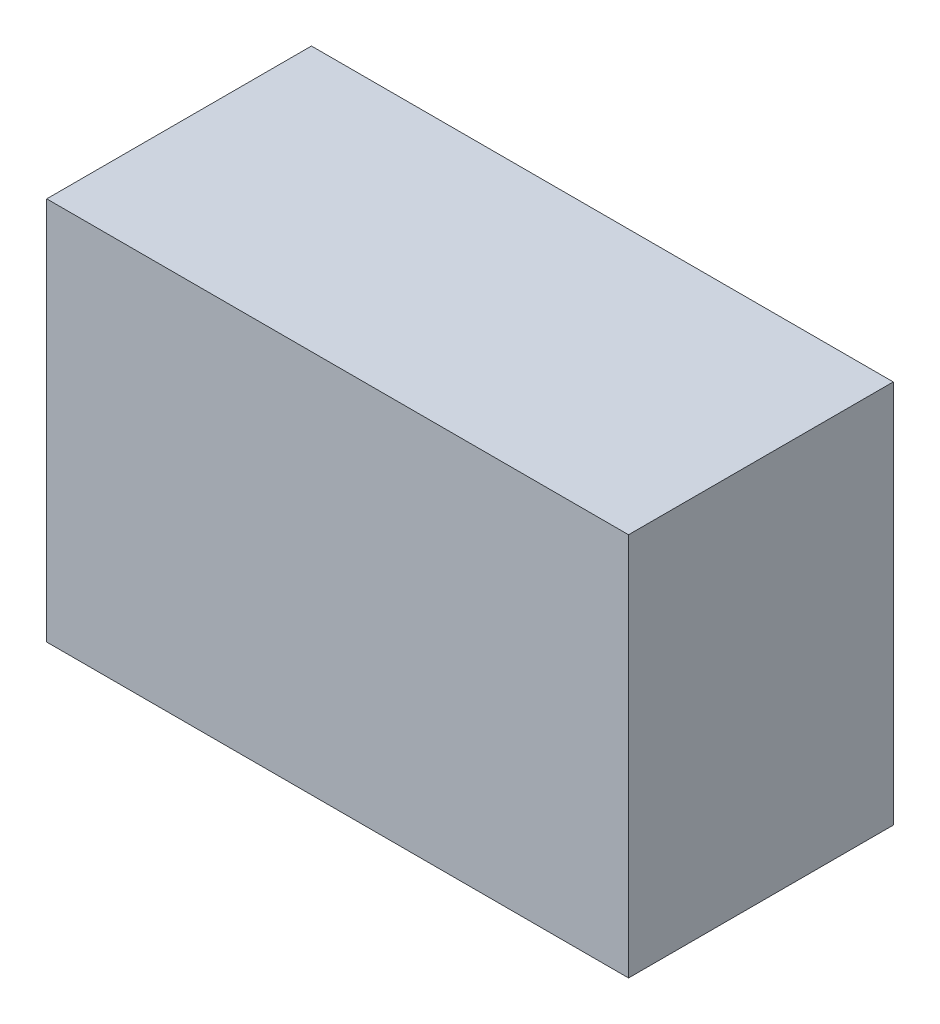
ISO-10303-21;
HEADER;
FILE_DESCRIPTION(('STEP AP214'),'2;1');
FILE_NAME('part.step','',(''),(''),'','','');
FILE_SCHEMA(('AUTOMOTIVE_DESIGN { 1 0 10303 214 1 1 1 1 }'));
ENDSEC;
DATA;
#1=APPLICATION_CONTEXT('core data for automotive mechanical design processes');
#2=APPLICATION_PROTOCOL_DEFINITION('international standard','automotive_design',2000,#1);
#3=PRODUCT_CONTEXT('',#1,'mechanical');
#4=PRODUCT('Part','Part','',(#3));
#5=PRODUCT_RELATED_PRODUCT_CATEGORY('part','',(#4));
#6=PRODUCT_DEFINITION_FORMATION('','',#4);
#7=PRODUCT_DEFINITION_CONTEXT('part definition',#1,'design');
#8=PRODUCT_DEFINITION('design','',#6,#7);
#9=PRODUCT_DEFINITION_SHAPE('','',#8);
#10=(LENGTH_UNIT() NAMED_UNIT(*) SI_UNIT(.MILLI.,.METRE.));
#11=(NAMED_UNIT(*) PLANE_ANGLE_UNIT() SI_UNIT($,.RADIAN.));
#12=(NAMED_UNIT(*) SI_UNIT($,.STERADIAN.) SOLID_ANGLE_UNIT());
#13=UNCERTAINTY_MEASURE_WITH_UNIT(LENGTH_MEASURE(1.E-05),#10,'distance_accuracy_value','');
#14=(GEOMETRIC_REPRESENTATION_CONTEXT(3) GLOBAL_UNCERTAINTY_ASSIGNED_CONTEXT((#13)) GLOBAL_UNIT_ASSIGNED_CONTEXT((#10,
#11,#12)) REPRESENTATION_CONTEXT('',''));
#15=CARTESIAN_POINT('',(0.,0.,0.));
#16=DIRECTION('',(0.,0.,1.));
#17=DIRECTION('',(1.,0.,0.));
#18=AXIS2_PLACEMENT_3D('',#15,#16,#17);
#19=CARTESIAN_POINT('',(0.,0.,1.));
#20=DIRECTION('',(0.,0.,1.));
#21=DIRECTION('',(1.,0.,0.));
#22=AXIS2_PLACEMENT_3D('',#19,#20,#21);
#23=PLANE('',#22);
#24=DIRECTION('',(1.,0.,0.));
#25=VECTOR('',#24,1.);
#26=CARTESIAN_POINT('',(1.1057,0.7262,1.));
#27=LINE('',#26,#25);
#28=CARTESIAN_POINT('',(-1.0922,0.7262,1.));
#29=VERTEX_POINT('',#28);
#30=CARTESIAN_POINT('',(1.1057,0.7262,1.));
#31=VERTEX_POINT('',#30);
#32=EDGE_CURVE('E68',#29,#31,#27,.T.);
#33=ORIENTED_EDGE('',*,*,#32,.F.);
#34=DIRECTION('',(0.,1.,0.));
#35=VECTOR('',#34,1.);
#36=CARTESIAN_POINT('',(-1.0922,0.7262,1.));
#37=LINE('',#36,#35);
#38=CARTESIAN_POINT('',(-1.0922,-0.7239,1.));
#39=VERTEX_POINT('',#38);
#40=EDGE_CURVE('E20',#39,#29,#37,.T.);
#41=ORIENTED_EDGE('',*,*,#40,.F.);
#42=DIRECTION('',(1.,0.,0.));
#43=VECTOR('',#42,1.);
#44=CARTESIAN_POINT('',(-1.0922,-0.7239,1.));
#45=LINE('',#44,#43);
#46=CARTESIAN_POINT('',(1.1057,-0.7239,1.));
#47=VERTEX_POINT('',#46);
#48=EDGE_CURVE('E58',#47,#39,#45,.F.);
#49=ORIENTED_EDGE('',*,*,#48,.F.);
#50=DIRECTION('',(0.,1.,0.));
#51=VECTOR('',#50,1.);
#52=CARTESIAN_POINT('',(1.1057,-0.7239,1.));
#53=LINE('',#52,#51);
#54=EDGE_CURVE('E53',#31,#47,#53,.F.);
#55=ORIENTED_EDGE('',*,*,#54,.F.);
#56=EDGE_LOOP('',(#33,#41,#49,#55));
#57=FACE_BOUND('',#56,.T.);
#58=ADVANCED_FACE('F17',(#57),#23,.T.);
#59=CARTESIAN_POINT('',(-1.0922,0.7262,0.));
#60=DIRECTION('',(-1.,0.,0.));
#61=DIRECTION('',(0.,0.,1.));
#62=AXIS2_PLACEMENT_3D('',#59,#60,#61);
#63=PLANE('',#62);
#64=DIRECTION('',(0.,0.,1.));
#65=VECTOR('',#64,1.);
#66=CARTESIAN_POINT('',(-1.0922,0.7262,0.));
#67=LINE('',#66,#65);
#68=CARTESIAN_POINT('',(-1.0922,0.7262,0.));
#69=VERTEX_POINT('',#68);
#70=EDGE_CURVE('E79',#69,#29,#67,.T.);
#71=ORIENTED_EDGE('',*,*,#70,.F.);
#72=DIRECTION('',(0.,1.,0.));
#73=VECTOR('',#72,1.);
#74=CARTESIAN_POINT('',(-1.0922,0.,0.));
#75=LINE('',#74,#73);
#76=CARTESIAN_POINT('',(-1.0922,-0.7239,0.));
#77=VERTEX_POINT('',#76);
#78=EDGE_CURVE('E74',#69,#77,#75,.F.);
#79=ORIENTED_EDGE('',*,*,#78,.T.);
#80=DIRECTION('',(0.,0.,-1.));
#81=VECTOR('',#80,1.);
#82=CARTESIAN_POINT('',(-1.0922,-0.7239,0.));
#83=LINE('',#82,#81);
#84=EDGE_CURVE('E63',#39,#77,#83,.T.);
#85=ORIENTED_EDGE('',*,*,#84,.F.);
#86=ORIENTED_EDGE('',*,*,#40,.T.);
#87=EDGE_LOOP('',(#71,#79,#85,#86));
#88=FACE_BOUND('',#87,.T.);
#89=ADVANCED_FACE('F73',(#88),#63,.T.);
#90=CARTESIAN_POINT('',(-1.0922,-0.7239,0.));
#91=DIRECTION('',(0.,-1.,0.));
#92=DIRECTION('',(0.,0.,-1.));
#93=AXIS2_PLACEMENT_3D('',#90,#91,#92);
#94=PLANE('',#93);
#95=ORIENTED_EDGE('',*,*,#84,.T.);
#96=DIRECTION('',(1.,0.,0.));
#97=VECTOR('',#96,1.);
#98=CARTESIAN_POINT('',(0.,-0.7239,0.));
#99=LINE('',#98,#97);
#100=CARTESIAN_POINT('',(1.1057,-0.7239,0.));
#101=VERTEX_POINT('',#100);
#102=EDGE_CURVE('E84',#77,#101,#99,.T.);
#103=ORIENTED_EDGE('',*,*,#102,.T.);
#104=DIRECTION('',(0.,0.,-1.));
#105=VECTOR('',#104,1.);
#106=CARTESIAN_POINT('',(1.1057,-0.7239,0.));
#107=LINE('',#106,#105);
#108=EDGE_CURVE('E65',#47,#101,#107,.T.);
#109=ORIENTED_EDGE('',*,*,#108,.F.);
#110=ORIENTED_EDGE('',*,*,#48,.T.);
#111=EDGE_LOOP('',(#95,#103,#109,#110));
#112=FACE_BOUND('',#111,.T.);
#113=ADVANCED_FACE('F60',(#112),#94,.T.);
#114=CARTESIAN_POINT('',(1.1057,-0.7239,0.));
#115=DIRECTION('',(1.,0.,0.));
#116=DIRECTION('',(0.,0.,-1.));
#117=AXIS2_PLACEMENT_3D('',#114,#115,#116);
#118=PLANE('',#117);
#119=ORIENTED_EDGE('',*,*,#108,.T.);
#120=DIRECTION('',(0.,1.,0.));
#121=VECTOR('',#120,1.);
#122=CARTESIAN_POINT('',(1.1057,0.,0.));
#123=LINE('',#122,#121);
#124=CARTESIAN_POINT('',(1.1057,0.7262,0.));
#125=VERTEX_POINT('',#124);
#126=EDGE_CURVE('E26',#101,#125,#123,.T.);
#127=ORIENTED_EDGE('',*,*,#126,.T.);
#128=DIRECTION('',(0.,0.,1.));
#129=VECTOR('',#128,1.);
#130=CARTESIAN_POINT('',(1.1057,0.7262,0.));
#131=LINE('',#130,#129);
#132=EDGE_CURVE('E34',#31,#125,#131,.F.);
#133=ORIENTED_EDGE('',*,*,#132,.F.);
#134=ORIENTED_EDGE('',*,*,#54,.T.);
#135=EDGE_LOOP('',(#119,#127,#133,#134));
#136=FACE_BOUND('',#135,.T.);
#137=ADVANCED_FACE('F88',(#136),#118,.T.);
#138=CARTESIAN_POINT('',(1.1057,0.7262,0.));
#139=DIRECTION('',(0.,1.,0.));
#140=DIRECTION('',(0.,0.,1.));
#141=AXIS2_PLACEMENT_3D('',#138,#139,#140);
#142=PLANE('',#141);
#143=ORIENTED_EDGE('',*,*,#132,.T.);
#144=DIRECTION('',(1.,0.,0.));
#145=VECTOR('',#144,1.);
#146=CARTESIAN_POINT('',(0.,0.7262,0.));
#147=LINE('',#146,#145);
#148=EDGE_CURVE('E11',#125,#69,#147,.F.);
#149=ORIENTED_EDGE('',*,*,#148,.T.);
#150=ORIENTED_EDGE('',*,*,#70,.T.);
#151=ORIENTED_EDGE('',*,*,#32,.T.);
#152=EDGE_LOOP('',(#143,#149,#150,#151));
#153=FACE_BOUND('',#152,.T.);
#154=ADVANCED_FACE('F91',(#153),#142,.T.);
#155=CARTESIAN_POINT('',(0.,0.,0.));
#156=DIRECTION('',(0.,0.,1.));
#157=DIRECTION('',(1.,0.,0.));
#158=AXIS2_PLACEMENT_3D('',#155,#156,#157);
#159=PLANE('',#158);
#160=ORIENTED_EDGE('',*,*,#126,.F.);
#161=ORIENTED_EDGE('',*,*,#102,.F.);
#162=ORIENTED_EDGE('',*,*,#78,.F.);
#163=ORIENTED_EDGE('',*,*,#148,.F.);
#164=EDGE_LOOP('',(#160,#161,#162,#163));
#165=FACE_BOUND('',#164,.T.);
#166=ADVANCED_FACE('F90',(#165),#159,.F.);
#167=CLOSED_SHELL('',(#58,#89,#113,#137,#154,#166));
#168=MANIFOLD_SOLID_BREP('B1',#167);
#169=ADVANCED_BREP_SHAPE_REPRESENTATION('',(#18,#168),#14);
#170=SHAPE_DEFINITION_REPRESENTATION(#9,#169);
ENDSEC;
END-ISO-10303-21;
